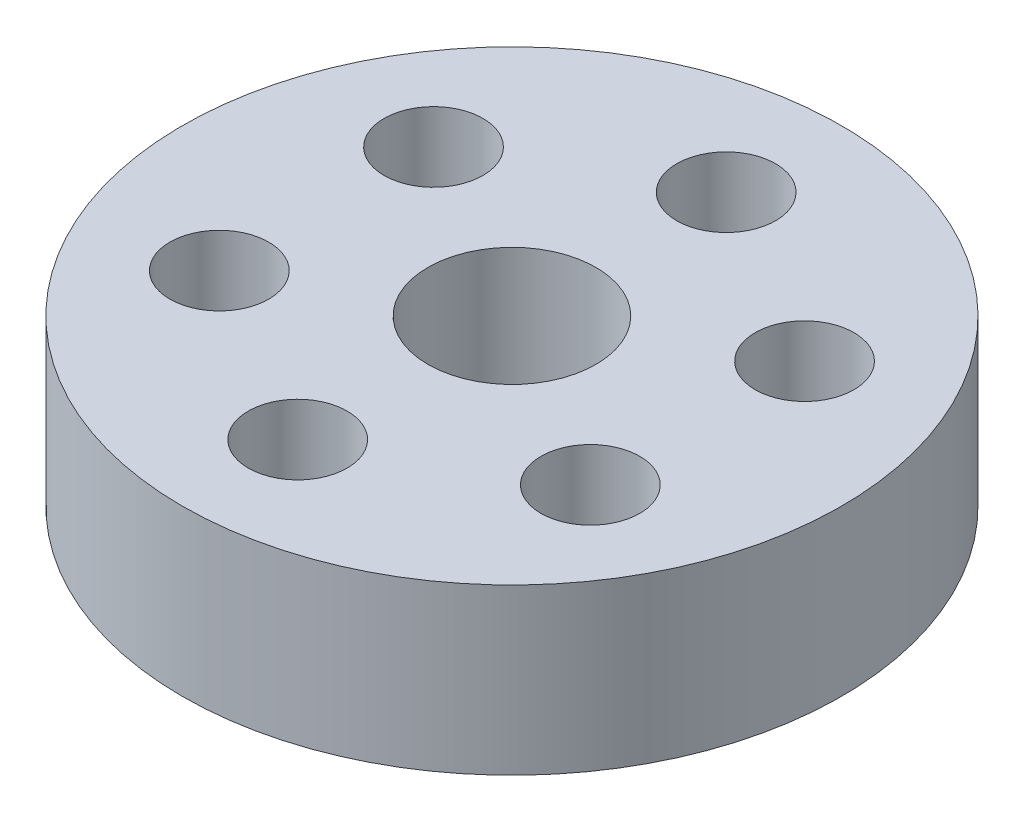
ISO-10303-21;
HEADER;
FILE_DESCRIPTION(('STEP AP214'),'2;1');
FILE_NAME('part.step','',(''),(''),'','','');
FILE_SCHEMA(('AUTOMOTIVE_DESIGN { 1 0 10303 214 1 1 1 1 }'));
ENDSEC;
DATA;
#1=APPLICATION_CONTEXT('core data for automotive mechanical design processes');
#2=APPLICATION_PROTOCOL_DEFINITION('international standard','automotive_design',2000,#1);
#3=PRODUCT_CONTEXT('',#1,'mechanical');
#4=PRODUCT('Part','Part','',(#3));
#5=PRODUCT_RELATED_PRODUCT_CATEGORY('part','',(#4));
#6=PRODUCT_DEFINITION_FORMATION('','',#4);
#7=PRODUCT_DEFINITION_CONTEXT('part definition',#1,'design');
#8=PRODUCT_DEFINITION('design','',#6,#7);
#9=PRODUCT_DEFINITION_SHAPE('','',#8);
#10=(LENGTH_UNIT() NAMED_UNIT(*) SI_UNIT(.MILLI.,.METRE.));
#11=(NAMED_UNIT(*) PLANE_ANGLE_UNIT() SI_UNIT($,.RADIAN.));
#12=(NAMED_UNIT(*) SI_UNIT($,.STERADIAN.) SOLID_ANGLE_UNIT());
#13=UNCERTAINTY_MEASURE_WITH_UNIT(LENGTH_MEASURE(1.E-05),#10,'distance_accuracy_value','');
#14=(GEOMETRIC_REPRESENTATION_CONTEXT(3) GLOBAL_UNCERTAINTY_ASSIGNED_CONTEXT((#13)) GLOBAL_UNIT_ASSIGNED_CONTEXT((#10,
#11,#12)) REPRESENTATION_CONTEXT('',''));
#15=CARTESIAN_POINT('',(0.,0.,0.));
#16=DIRECTION('',(0.,0.,1.));
#17=DIRECTION('',(1.,0.,0.));
#18=AXIS2_PLACEMENT_3D('',#15,#16,#17);
#19=CARTESIAN_POINT('',(0.,6.35,0.));
#20=DIRECTION('',(0.,1.,0.));
#21=DIRECTION('',(0.,0.,1.));
#22=AXIS2_PLACEMENT_3D('',#19,#20,#21);
#23=PLANE('',#22);
#24=CARTESIAN_POINT('',(-7.14903970824054,6.35,4.1275));
#25=DIRECTION('',(0.,1.,0.));
#26=DIRECTION('',(0.,0.,1.));
#27=AXIS2_PLACEMENT_3D('',#24,#25,#26);
#28=CIRCLE('',#27,1.905);
#29=CARTESIAN_POINT('',(-7.14903970824054,6.35,6.0325));
#30=VERTEX_POINT('',#29);
#31=EDGE_CURVE('E81',#30,#30,#28,.T.);
#32=ORIENTED_EDGE('',*,*,#31,.F.);
#33=EDGE_LOOP('',(#32));
#34=FACE_BOUND('',#33,.T.);
#35=CARTESIAN_POINT('',(7.14903970824054,6.35,4.1275));
#36=DIRECTION('',(0.,1.,0.));
#37=DIRECTION('',(0.,0.,1.));
#38=AXIS2_PLACEMENT_3D('',#35,#36,#37);
#39=CIRCLE('',#38,1.905);
#40=CARTESIAN_POINT('',(7.14903970824054,6.35,6.0325));
#41=VERTEX_POINT('',#40);
#42=EDGE_CURVE('E69',#41,#41,#39,.T.);
#43=ORIENTED_EDGE('',*,*,#42,.F.);
#44=EDGE_LOOP('',(#43));
#45=FACE_BOUND('',#44,.T.);
#46=CARTESIAN_POINT('',(0.,6.35,0.));
#47=DIRECTION('',(0.,1.,0.));
#48=DIRECTION('',(0.,0.,1.));
#49=AXIS2_PLACEMENT_3D('',#46,#47,#48);
#50=CIRCLE('',#49,3.2385);
#51=CARTESIAN_POINT('',(0.,6.35,3.2385));
#52=VERTEX_POINT('',#51);
#53=EDGE_CURVE('E57',#52,#52,#50,.T.);
#54=ORIENTED_EDGE('',*,*,#53,.F.);
#55=EDGE_LOOP('',(#54));
#56=FACE_BOUND('',#55,.T.);
#57=CARTESIAN_POINT('',(0.,6.35,0.));
#58=DIRECTION('',(0.,1.,0.));
#59=DIRECTION('',(0.,0.,1.));
#60=AXIS2_PLACEMENT_3D('',#57,#58,#59);
#61=CIRCLE('',#60,12.7);
#62=CARTESIAN_POINT('',(0.,6.35,12.7));
#63=VERTEX_POINT('',#62);
#64=EDGE_CURVE('E10',#63,#63,#61,.T.);
#65=ORIENTED_EDGE('',*,*,#64,.T.);
#66=EDGE_LOOP('',(#65));
#67=FACE_BOUND('',#66,.T.);
#68=CARTESIAN_POINT('',(0.,6.35,-8.255));
#69=DIRECTION('',(0.,1.,0.));
#70=DIRECTION('',(0.,0.,1.));
#71=AXIS2_PLACEMENT_3D('',#68,#69,#70);
#72=CIRCLE('',#71,1.905);
#73=CARTESIAN_POINT('',(0.,6.35,-6.35));
#74=VERTEX_POINT('',#73);
#75=EDGE_CURVE('E52',#74,#74,#72,.T.);
#76=ORIENTED_EDGE('',*,*,#75,.F.);
#77=EDGE_LOOP('',(#76));
#78=FACE_BOUND('',#77,.T.);
#79=CARTESIAN_POINT('',(7.14903970824054,6.35,-4.1275));
#80=DIRECTION('',(0.,1.,0.));
#81=DIRECTION('',(0.,0.,1.));
#82=AXIS2_PLACEMENT_3D('',#79,#80,#81);
#83=CIRCLE('',#82,1.905);
#84=CARTESIAN_POINT('',(7.14903970824054,6.35,-2.2225));
#85=VERTEX_POINT('',#84);
#86=EDGE_CURVE('E63',#85,#85,#83,.T.);
#87=ORIENTED_EDGE('',*,*,#86,.F.);
#88=EDGE_LOOP('',(#87));
#89=FACE_BOUND('',#88,.T.);
#90=CARTESIAN_POINT('',(0.,6.35,8.255));
#91=DIRECTION('',(0.,1.,0.));
#92=DIRECTION('',(0.,0.,1.));
#93=AXIS2_PLACEMENT_3D('',#90,#91,#92);
#94=CIRCLE('',#93,1.905);
#95=CARTESIAN_POINT('',(0.,6.35,10.16));
#96=VERTEX_POINT('',#95);
#97=EDGE_CURVE('E75',#96,#96,#94,.T.);
#98=ORIENTED_EDGE('',*,*,#97,.F.);
#99=EDGE_LOOP('',(#98));
#100=FACE_BOUND('',#99,.T.);
#101=CARTESIAN_POINT('',(-7.14903970824054,6.35,-4.12749999999999));
#102=DIRECTION('',(0.,1.,0.));
#103=DIRECTION('',(0.,0.,1.));
#104=AXIS2_PLACEMENT_3D('',#101,#102,#103);
#105=CIRCLE('',#104,1.905);
#106=CARTESIAN_POINT('',(-7.14903970824054,6.35,-2.22249999999999));
#107=VERTEX_POINT('',#106);
#108=EDGE_CURVE('E87',#107,#107,#105,.T.);
#109=ORIENTED_EDGE('',*,*,#108,.F.);
#110=EDGE_LOOP('',(#109));
#111=FACE_BOUND('',#110,.T.);
#112=ADVANCED_FACE('F41',(#34,#45,#56,#67,#78,#89,#100,#111),#23,.T.);
#113=CARTESIAN_POINT('',(0.,0.,0.));
#114=DIRECTION('',(0.,1.,0.));
#115=DIRECTION('',(0.,0.,1.));
#116=AXIS2_PLACEMENT_3D('',#113,#114,#115);
#117=PLANE('',#116);
#118=CARTESIAN_POINT('',(0.,0.,0.));
#119=DIRECTION('',(0.,1.,0.));
#120=DIRECTION('',(0.,0.,1.));
#121=AXIS2_PLACEMENT_3D('',#118,#119,#120);
#122=CIRCLE('',#121,12.7);
#123=CARTESIAN_POINT('',(0.,0.,12.7));
#124=VERTEX_POINT('',#123);
#125=EDGE_CURVE('E45',#124,#124,#122,.T.);
#126=ORIENTED_EDGE('',*,*,#125,.F.);
#127=EDGE_LOOP('',(#126));
#128=FACE_BOUND('',#127,.T.);
#129=CARTESIAN_POINT('',(0.,0.,-8.255));
#130=DIRECTION('',(0.,1.,0.));
#131=DIRECTION('',(0.,0.,1.));
#132=AXIS2_PLACEMENT_3D('',#129,#130,#131);
#133=CIRCLE('',#132,1.905);
#134=CARTESIAN_POINT('',(0.,0.,-6.35));
#135=VERTEX_POINT('',#134);
#136=EDGE_CURVE('E54',#135,#135,#133,.T.);
#137=ORIENTED_EDGE('',*,*,#136,.T.);
#138=EDGE_LOOP('',(#137));
#139=FACE_BOUND('',#138,.T.);
#140=CARTESIAN_POINT('',(0.,0.,0.));
#141=DIRECTION('',(0.,1.,0.));
#142=DIRECTION('',(0.,0.,1.));
#143=AXIS2_PLACEMENT_3D('',#140,#141,#142);
#144=CIRCLE('',#143,3.2385);
#145=CARTESIAN_POINT('',(0.,0.,3.2385));
#146=VERTEX_POINT('',#145);
#147=EDGE_CURVE('E60',#146,#146,#144,.T.);
#148=ORIENTED_EDGE('',*,*,#147,.T.);
#149=EDGE_LOOP('',(#148));
#150=FACE_BOUND('',#149,.T.);
#151=CARTESIAN_POINT('',(7.14903970824054,0.,-4.1275));
#152=DIRECTION('',(0.,1.,0.));
#153=DIRECTION('',(0.,0.,1.));
#154=AXIS2_PLACEMENT_3D('',#151,#152,#153);
#155=CIRCLE('',#154,1.905);
#156=CARTESIAN_POINT('',(7.14903970824054,0.,-2.2225));
#157=VERTEX_POINT('',#156);
#158=EDGE_CURVE('E66',#157,#157,#155,.T.);
#159=ORIENTED_EDGE('',*,*,#158,.T.);
#160=EDGE_LOOP('',(#159));
#161=FACE_BOUND('',#160,.T.);
#162=CARTESIAN_POINT('',(7.14903970824054,0.,4.1275));
#163=DIRECTION('',(0.,1.,0.));
#164=DIRECTION('',(0.,0.,1.));
#165=AXIS2_PLACEMENT_3D('',#162,#163,#164);
#166=CIRCLE('',#165,1.905);
#167=CARTESIAN_POINT('',(7.14903970824054,0.,6.0325));
#168=VERTEX_POINT('',#167);
#169=EDGE_CURVE('E72',#168,#168,#166,.T.);
#170=ORIENTED_EDGE('',*,*,#169,.T.);
#171=EDGE_LOOP('',(#170));
#172=FACE_BOUND('',#171,.T.);
#173=CARTESIAN_POINT('',(0.,0.,8.255));
#174=DIRECTION('',(0.,1.,0.));
#175=DIRECTION('',(0.,0.,1.));
#176=AXIS2_PLACEMENT_3D('',#173,#174,#175);
#177=CIRCLE('',#176,1.905);
#178=CARTESIAN_POINT('',(0.,0.,10.16));
#179=VERTEX_POINT('',#178);
#180=EDGE_CURVE('E78',#179,#179,#177,.T.);
#181=ORIENTED_EDGE('',*,*,#180,.T.);
#182=EDGE_LOOP('',(#181));
#183=FACE_BOUND('',#182,.T.);
#184=CARTESIAN_POINT('',(-7.14903970824054,0.,4.1275));
#185=DIRECTION('',(0.,1.,0.));
#186=DIRECTION('',(0.,0.,1.));
#187=AXIS2_PLACEMENT_3D('',#184,#185,#186);
#188=CIRCLE('',#187,1.905);
#189=CARTESIAN_POINT('',(-7.14903970824054,0.,6.0325));
#190=VERTEX_POINT('',#189);
#191=EDGE_CURVE('E84',#190,#190,#188,.T.);
#192=ORIENTED_EDGE('',*,*,#191,.T.);
#193=EDGE_LOOP('',(#192));
#194=FACE_BOUND('',#193,.T.);
#195=CARTESIAN_POINT('',(-7.14903970824054,0.,-4.12749999999999));
#196=DIRECTION('',(0.,1.,0.));
#197=DIRECTION('',(0.,0.,1.));
#198=AXIS2_PLACEMENT_3D('',#195,#196,#197);
#199=CIRCLE('',#198,1.905);
#200=CARTESIAN_POINT('',(-7.14903970824054,0.,-2.22249999999999));
#201=VERTEX_POINT('',#200);
#202=EDGE_CURVE('E90',#201,#201,#199,.T.);
#203=ORIENTED_EDGE('',*,*,#202,.T.);
#204=EDGE_LOOP('',(#203));
#205=FACE_BOUND('',#204,.T.);
#206=ADVANCED_FACE('F100',(#128,#139,#150,#161,#172,#183,#194,#205),#117,.F.);
#207=CARTESIAN_POINT('',(0.,6.35,0.));
#208=DIRECTION('',(0.,-1.,0.));
#209=DIRECTION('',(0.,0.,-1.));
#210=AXIS2_PLACEMENT_3D('',#207,#208,#209);
#211=CYLINDRICAL_SURFACE('',#210,12.7);
#212=ORIENTED_EDGE('',*,*,#64,.F.);
#213=EDGE_LOOP('',(#212));
#214=FACE_BOUND('',#213,.T.);
#215=ORIENTED_EDGE('',*,*,#125,.T.);
#216=EDGE_LOOP('',(#215));
#217=FACE_BOUND('',#216,.T.);
#218=ADVANCED_FACE('F43',(#214,#217),#211,.T.);
#219=CARTESIAN_POINT('',(0.,6.35,-8.255));
#220=DIRECTION('',(0.,-1.,0.));
#221=DIRECTION('',(0.,0.,-1.));
#222=AXIS2_PLACEMENT_3D('',#219,#220,#221);
#223=CYLINDRICAL_SURFACE('',#222,1.905);
#224=ORIENTED_EDGE('',*,*,#75,.T.);
#225=EDGE_LOOP('',(#224));
#226=FACE_BOUND('',#225,.T.);
#227=ORIENTED_EDGE('',*,*,#136,.F.);
#228=EDGE_LOOP('',(#227));
#229=FACE_BOUND('',#228,.T.);
#230=ADVANCED_FACE('F110',(#226,#229),#223,.F.);
#231=CARTESIAN_POINT('',(0.,6.35,0.));
#232=DIRECTION('',(0.,-1.,0.));
#233=DIRECTION('',(0.,0.,-1.));
#234=AXIS2_PLACEMENT_3D('',#231,#232,#233);
#235=CYLINDRICAL_SURFACE('',#234,3.2385);
#236=ORIENTED_EDGE('',*,*,#53,.T.);
#237=EDGE_LOOP('',(#236));
#238=FACE_BOUND('',#237,.T.);
#239=ORIENTED_EDGE('',*,*,#147,.F.);
#240=EDGE_LOOP('',(#239));
#241=FACE_BOUND('',#240,.T.);
#242=ADVANCED_FACE('F113',(#238,#241),#235,.F.);
#243=CARTESIAN_POINT('',(7.14903970824054,6.35,-4.1275));
#244=DIRECTION('',(0.,-1.,0.));
#245=DIRECTION('',(0.,0.,-1.));
#246=AXIS2_PLACEMENT_3D('',#243,#244,#245);
#247=CYLINDRICAL_SURFACE('',#246,1.905);
#248=ORIENTED_EDGE('',*,*,#86,.T.);
#249=EDGE_LOOP('',(#248));
#250=FACE_BOUND('',#249,.T.);
#251=ORIENTED_EDGE('',*,*,#158,.F.);
#252=EDGE_LOOP('',(#251));
#253=FACE_BOUND('',#252,.T.);
#254=ADVANCED_FACE('F117',(#250,#253),#247,.F.);
#255=CARTESIAN_POINT('',(7.14903970824054,6.35,4.1275));
#256=DIRECTION('',(0.,-1.,0.));
#257=DIRECTION('',(0.,0.,-1.));
#258=AXIS2_PLACEMENT_3D('',#255,#256,#257);
#259=CYLINDRICAL_SURFACE('',#258,1.905);
#260=ORIENTED_EDGE('',*,*,#42,.T.);
#261=EDGE_LOOP('',(#260));
#262=FACE_BOUND('',#261,.T.);
#263=ORIENTED_EDGE('',*,*,#169,.F.);
#264=EDGE_LOOP('',(#263));
#265=FACE_BOUND('',#264,.T.);
#266=ADVANCED_FACE('F121',(#262,#265),#259,.F.);
#267=CARTESIAN_POINT('',(0.,6.35,8.255));
#268=DIRECTION('',(0.,-1.,0.));
#269=DIRECTION('',(0.,0.,-1.));
#270=AXIS2_PLACEMENT_3D('',#267,#268,#269);
#271=CYLINDRICAL_SURFACE('',#270,1.905);
#272=ORIENTED_EDGE('',*,*,#97,.T.);
#273=EDGE_LOOP('',(#272));
#274=FACE_BOUND('',#273,.T.);
#275=ORIENTED_EDGE('',*,*,#180,.F.);
#276=EDGE_LOOP('',(#275));
#277=FACE_BOUND('',#276,.T.);
#278=ADVANCED_FACE('F125',(#274,#277),#271,.F.);
#279=CARTESIAN_POINT('',(-7.14903970824054,6.35,4.1275));
#280=DIRECTION('',(0.,-1.,0.));
#281=DIRECTION('',(0.,0.,-1.));
#282=AXIS2_PLACEMENT_3D('',#279,#280,#281);
#283=CYLINDRICAL_SURFACE('',#282,1.905);
#284=ORIENTED_EDGE('',*,*,#31,.T.);
#285=EDGE_LOOP('',(#284));
#286=FACE_BOUND('',#285,.T.);
#287=ORIENTED_EDGE('',*,*,#191,.F.);
#288=EDGE_LOOP('',(#287));
#289=FACE_BOUND('',#288,.T.);
#290=ADVANCED_FACE('F129',(#286,#289),#283,.F.);
#291=CARTESIAN_POINT('',(-7.14903970824054,6.35,-4.12749999999999));
#292=DIRECTION('',(0.,-1.,0.));
#293=DIRECTION('',(0.,0.,-1.));
#294=AXIS2_PLACEMENT_3D('',#291,#292,#293);
#295=CYLINDRICAL_SURFACE('',#294,1.905);
#296=ORIENTED_EDGE('',*,*,#108,.T.);
#297=EDGE_LOOP('',(#296));
#298=FACE_BOUND('',#297,.T.);
#299=ORIENTED_EDGE('',*,*,#202,.F.);
#300=EDGE_LOOP('',(#299));
#301=FACE_BOUND('',#300,.T.);
#302=ADVANCED_FACE('F96',(#298,#301),#295,.F.);
#303=CLOSED_SHELL('',(#112,#206,#218,#230,#242,#254,#266,#278,#290,#302));
#304=MANIFOLD_SOLID_BREP('B2',#303);
#305=ADVANCED_BREP_SHAPE_REPRESENTATION('',(#18,#304),#14);
#306=SHAPE_DEFINITION_REPRESENTATION(#9,#305);
ENDSEC;
END-ISO-10303-21;
